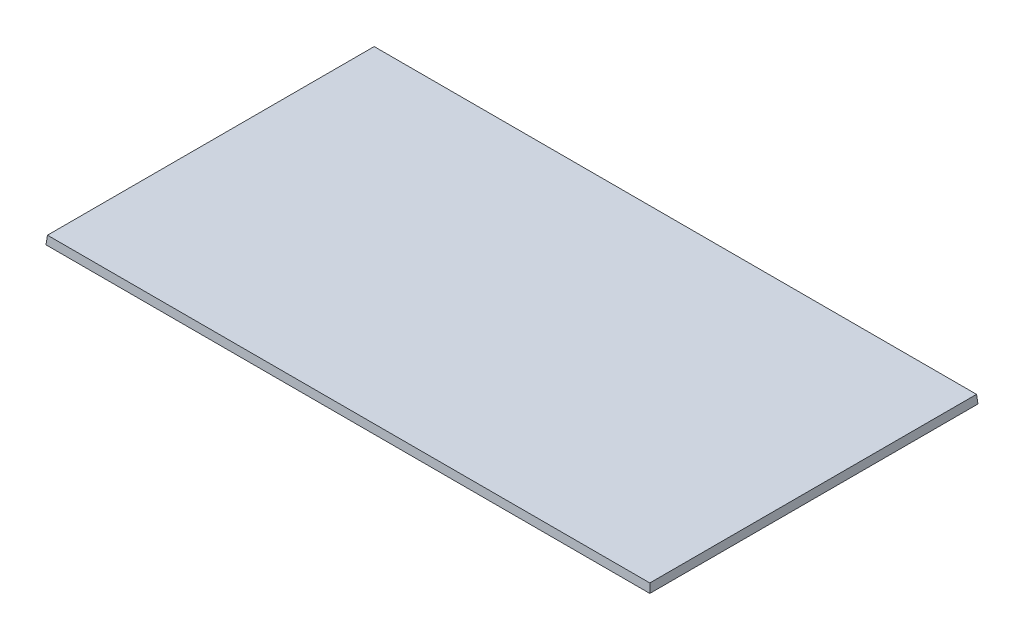
ISO-10303-21;
HEADER;
FILE_DESCRIPTION(('STEP AP214'),'2;1');
FILE_NAME('part.step','',(''),(''),'','','');
FILE_SCHEMA(('AUTOMOTIVE_DESIGN { 1 0 10303 214 1 1 1 1 }'));
ENDSEC;
DATA;
#1=APPLICATION_CONTEXT('core data for automotive mechanical design processes');
#2=APPLICATION_PROTOCOL_DEFINITION('international standard','automotive_design',2000,#1);
#3=PRODUCT_CONTEXT('',#1,'mechanical');
#4=PRODUCT('Part','Part','',(#3));
#5=PRODUCT_RELATED_PRODUCT_CATEGORY('part','',(#4));
#6=PRODUCT_DEFINITION_FORMATION('','',#4);
#7=PRODUCT_DEFINITION_CONTEXT('part definition',#1,'design');
#8=PRODUCT_DEFINITION('design','',#6,#7);
#9=PRODUCT_DEFINITION_SHAPE('','',#8);
#10=(LENGTH_UNIT() NAMED_UNIT(*) SI_UNIT(.MILLI.,.METRE.));
#11=(NAMED_UNIT(*) PLANE_ANGLE_UNIT() SI_UNIT($,.RADIAN.));
#12=(NAMED_UNIT(*) SI_UNIT($,.STERADIAN.) SOLID_ANGLE_UNIT());
#13=UNCERTAINTY_MEASURE_WITH_UNIT(LENGTH_MEASURE(1.E-05),#10,'distance_accuracy_value','');
#14=(GEOMETRIC_REPRESENTATION_CONTEXT(3) GLOBAL_UNCERTAINTY_ASSIGNED_CONTEXT((#13)) GLOBAL_UNIT_ASSIGNED_CONTEXT((#10,
#11,#12)) REPRESENTATION_CONTEXT('',''));
#15=CARTESIAN_POINT('',(0.,0.,0.));
#16=DIRECTION('',(0.,0.,1.));
#17=DIRECTION('',(1.,0.,0.));
#18=AXIS2_PLACEMENT_3D('',#15,#16,#17);
#19=CARTESIAN_POINT('',(0.,12.7,0.));
#20=DIRECTION('',(0.996194698091746,0.0871557427476584,0.));
#21=DIRECTION('',(-0.0871557427476584,0.996194698091746,0.));
#22=AXIS2_PLACEMENT_3D('',#19,#20,#21);
#23=PLANE('',#22);
#24=DIRECTION('',(0.,0.,-1.));
#25=VECTOR('',#24,1.);
#26=CARTESIAN_POINT('',(1.11110602677924,0.,0.));
#27=LINE('',#26,#25);
#28=CARTESIAN_POINT('',(1.11110602677924,0.,1.11110602677924));
#29=VERTEX_POINT('',#28);
#30=CARTESIAN_POINT('',(1.11110602677924,0.,-497.089580958069));
#31=VERTEX_POINT('',#30);
#32=EDGE_CURVE('E11',#29,#31,#27,.T.);
#33=ORIENTED_EDGE('',*,*,#32,.T.);
#34=DIRECTION('',(0.0868265938642478,-0.992432509138967,-0.0868265938642478));
#35=VECTOR('',#34,1.);
#36=CARTESIAN_POINT('',(0.,12.7,-495.978474931289));
#37=LINE('',#36,#35);
#38=CARTESIAN_POINT('',(0.,12.7,-495.978474931289));
#39=VERTEX_POINT('',#38);
#40=EDGE_CURVE('E36',#39,#31,#37,.T.);
#41=ORIENTED_EDGE('',*,*,#40,.F.);
#42=DIRECTION('',(0.,0.,-1.));
#43=VECTOR('',#42,1.);
#44=CARTESIAN_POINT('',(0.,12.7,0.));
#45=LINE('',#44,#43);
#46=CARTESIAN_POINT('',(0.,12.7,0.));
#47=VERTEX_POINT('',#46);
#48=EDGE_CURVE('E73',#47,#39,#45,.T.);
#49=ORIENTED_EDGE('',*,*,#48,.F.);
#50=DIRECTION('',(0.0868265938642478,-0.992432509138967,0.0868265938642478));
#51=VECTOR('',#50,1.);
#52=CARTESIAN_POINT('',(0.,12.7,0.));
#53=LINE('',#52,#51);
#54=EDGE_CURVE('E27',#47,#29,#53,.T.);
#55=ORIENTED_EDGE('',*,*,#54,.T.);
#56=EDGE_LOOP('',(#33,#41,#49,#55));
#57=FACE_BOUND('',#56,.T.);
#58=ADVANCED_FACE('F17',(#57),#23,.T.);
#59=CARTESIAN_POINT('',(0.,12.7,-495.978474931289));
#60=DIRECTION('',(0.,0.0871557427476584,-0.996194698091746));
#61=DIRECTION('',(0.,0.996194698091746,0.0871557427476584));
#62=AXIS2_PLACEMENT_3D('',#59,#60,#61);
#63=PLANE('',#62);
#64=DIRECTION('',(-1.,0.,0.));
#65=VECTOR('',#64,1.);
#66=CARTESIAN_POINT('',(0.,0.,-497.089580958069));
#67=LINE('',#66,#65);
#68=CARTESIAN_POINT('',(-915.511106026779,0.,-497.089580958069));
#69=VERTEX_POINT('',#68);
#70=EDGE_CURVE('E80',#31,#69,#67,.T.);
#71=ORIENTED_EDGE('',*,*,#70,.T.);
#72=DIRECTION('',(-0.0868265938642478,-0.992432509138967,-0.0868265938642478));
#73=VECTOR('',#72,1.);
#74=CARTESIAN_POINT('',(-910.660889002998,55.4382342615591,-492.239363934288));
#75=LINE('',#74,#73);
#76=CARTESIAN_POINT('',(-914.4,12.7,-495.978474931289));
#77=VERTEX_POINT('',#76);
#78=EDGE_CURVE('E86',#77,#69,#75,.T.);
#79=ORIENTED_EDGE('',*,*,#78,.F.);
#80=DIRECTION('',(-1.,0.,0.));
#81=VECTOR('',#80,1.);
#82=CARTESIAN_POINT('',(0.,12.7,-495.978474931289));
#83=LINE('',#82,#81);
#84=EDGE_CURVE('E64',#39,#77,#83,.T.);
#85=ORIENTED_EDGE('',*,*,#84,.F.);
#86=ORIENTED_EDGE('',*,*,#40,.T.);
#87=EDGE_LOOP('',(#71,#79,#85,#86));
#88=FACE_BOUND('',#87,.T.);
#89=ADVANCED_FACE('F90',(#88),#63,.T.);
#90=CARTESIAN_POINT('',(-914.4,12.7,0.));
#91=DIRECTION('',(-0.996194698091746,0.0871557427476584,0.));
#92=DIRECTION('',(-0.0871557427476584,-0.996194698091746,0.));
#93=AXIS2_PLACEMENT_3D('',#90,#91,#92);
#94=PLANE('',#93);
#95=DIRECTION('',(0.,0.,1.));
#96=VECTOR('',#95,1.);
#97=CARTESIAN_POINT('',(-915.511106026779,0.,0.));
#98=LINE('',#97,#96);
#99=CARTESIAN_POINT('',(-915.511106026779,0.,1.11110602677924));
#100=VERTEX_POINT('',#99);
#101=EDGE_CURVE('E70',#69,#100,#98,.T.);
#102=ORIENTED_EDGE('',*,*,#101,.T.);
#103=DIRECTION('',(-0.0868265938642478,-0.992432509138967,0.0868265938642478));
#104=VECTOR('',#103,1.);
#105=CARTESIAN_POINT('',(-907.50646879155,91.493422263302,-6.89353120845009));
#106=LINE('',#105,#104);
#107=CARTESIAN_POINT('',(-914.4,12.7,0.));
#108=VERTEX_POINT('',#107);
#109=EDGE_CURVE('E56',#108,#100,#106,.T.);
#110=ORIENTED_EDGE('',*,*,#109,.F.);
#111=DIRECTION('',(0.,0.,1.));
#112=VECTOR('',#111,1.);
#113=CARTESIAN_POINT('',(-914.4,12.7,0.));
#114=LINE('',#113,#112);
#115=EDGE_CURVE('E62',#77,#108,#114,.T.);
#116=ORIENTED_EDGE('',*,*,#115,.F.);
#117=ORIENTED_EDGE('',*,*,#78,.T.);
#118=EDGE_LOOP('',(#102,#110,#116,#117));
#119=FACE_BOUND('',#118,.T.);
#120=ADVANCED_FACE('F68',(#119),#94,.T.);
#121=CARTESIAN_POINT('',(0.,12.7,0.));
#122=DIRECTION('',(0.,0.0871557427476584,0.996194698091746));
#123=DIRECTION('',(0.,-0.996194698091746,0.0871557427476584));
#124=AXIS2_PLACEMENT_3D('',#121,#122,#123);
#125=PLANE('',#124);
#126=DIRECTION('',(1.,0.,0.));
#127=VECTOR('',#126,1.);
#128=CARTESIAN_POINT('',(0.,0.,1.11110602677924));
#129=LINE('',#128,#127);
#130=EDGE_CURVE('E72',#100,#29,#129,.T.);
#131=ORIENTED_EDGE('',*,*,#130,.T.);
#132=ORIENTED_EDGE('',*,*,#54,.F.);
#133=DIRECTION('',(1.,0.,0.));
#134=VECTOR('',#133,1.);
#135=CARTESIAN_POINT('',(0.,12.7,0.));
#136=LINE('',#135,#134);
#137=EDGE_CURVE('E21',#108,#47,#136,.T.);
#138=ORIENTED_EDGE('',*,*,#137,.F.);
#139=ORIENTED_EDGE('',*,*,#109,.T.);
#140=EDGE_LOOP('',(#131,#132,#138,#139));
#141=FACE_BOUND('',#140,.T.);
#142=ADVANCED_FACE('F76',(#141),#125,.T.);
#143=CARTESIAN_POINT('',(0.,12.7,0.));
#144=DIRECTION('',(0.,1.,0.));
#145=DIRECTION('',(0.,0.,1.));
#146=AXIS2_PLACEMENT_3D('',#143,#144,#145);
#147=PLANE('',#146);
#148=ORIENTED_EDGE('',*,*,#48,.T.);
#149=ORIENTED_EDGE('',*,*,#84,.T.);
#150=ORIENTED_EDGE('',*,*,#115,.T.);
#151=ORIENTED_EDGE('',*,*,#137,.T.);
#152=EDGE_LOOP('',(#148,#149,#150,#151));
#153=FACE_BOUND('',#152,.T.);
#154=ADVANCED_FACE('F63',(#153),#147,.T.);
#155=CARTESIAN_POINT('',(0.,0.,0.));
#156=DIRECTION('',(0.,1.,0.));
#157=DIRECTION('',(0.,0.,1.));
#158=AXIS2_PLACEMENT_3D('',#155,#156,#157);
#159=PLANE('',#158);
#160=ORIENTED_EDGE('',*,*,#32,.F.);
#161=ORIENTED_EDGE('',*,*,#130,.F.);
#162=ORIENTED_EDGE('',*,*,#101,.F.);
#163=ORIENTED_EDGE('',*,*,#70,.F.);
#164=EDGE_LOOP('',(#160,#161,#162,#163));
#165=FACE_BOUND('',#164,.T.);
#166=ADVANCED_FACE('F19',(#165),#159,.F.);
#167=CLOSED_SHELL('',(#58,#89,#120,#142,#154,#166));
#168=MANIFOLD_SOLID_BREP('B1',#167);
#169=ADVANCED_BREP_SHAPE_REPRESENTATION('',(#18,#168),#14);
#170=SHAPE_DEFINITION_REPRESENTATION(#9,#169);
ENDSEC;
END-ISO-10303-21;
